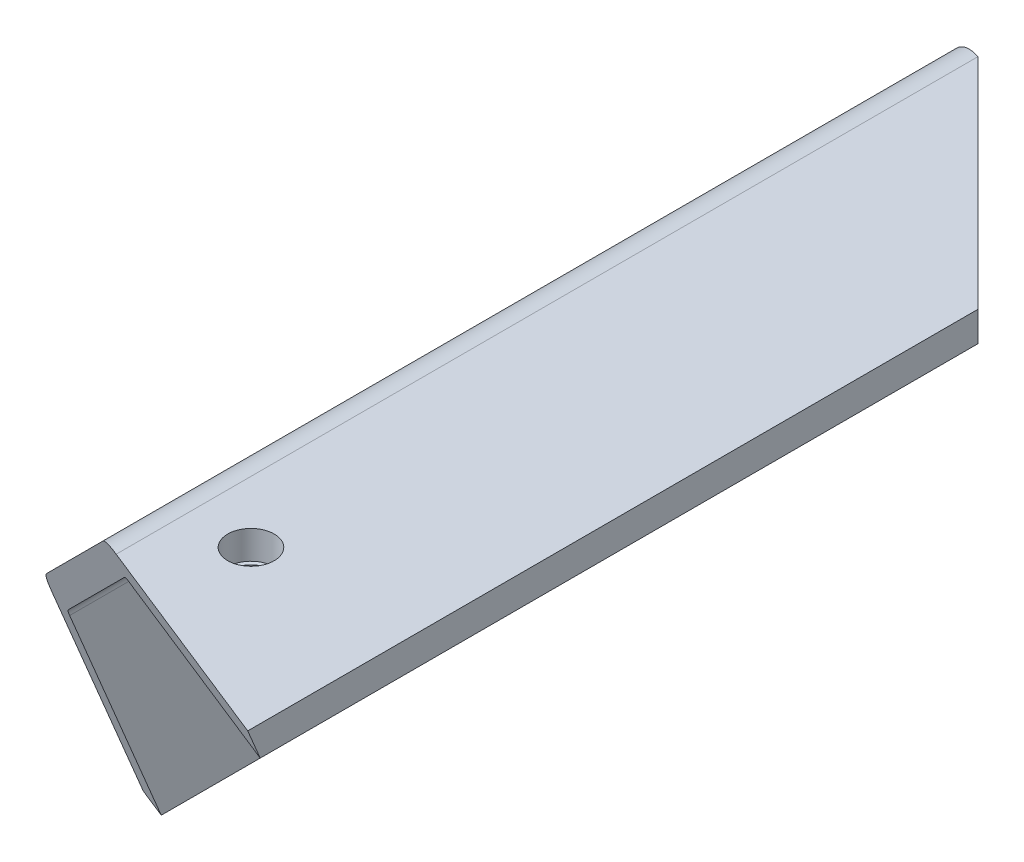
ISO-10303-21;
HEADER;
FILE_DESCRIPTION(('STEP AP214'),'2;1');
FILE_NAME('part.step','',(''),(''),'','','');
FILE_SCHEMA(('AUTOMOTIVE_DESIGN { 1 0 10303 214 1 1 1 1 }'));
ENDSEC;
DATA;
#1=APPLICATION_CONTEXT('core data for automotive mechanical design processes');
#2=APPLICATION_PROTOCOL_DEFINITION('international standard','automotive_design',2000,#1);
#3=PRODUCT_CONTEXT('',#1,'mechanical');
#4=PRODUCT('Part','Part','',(#3));
#5=PRODUCT_RELATED_PRODUCT_CATEGORY('part','',(#4));
#6=PRODUCT_DEFINITION_FORMATION('','',#4);
#7=PRODUCT_DEFINITION_CONTEXT('part definition',#1,'design');
#8=PRODUCT_DEFINITION('design','',#6,#7);
#9=PRODUCT_DEFINITION_SHAPE('','',#8);
#10=(LENGTH_UNIT() NAMED_UNIT(*) SI_UNIT(.MILLI.,.METRE.));
#11=(NAMED_UNIT(*) PLANE_ANGLE_UNIT() SI_UNIT($,.RADIAN.));
#12=(NAMED_UNIT(*) SI_UNIT($,.STERADIAN.) SOLID_ANGLE_UNIT());
#13=UNCERTAINTY_MEASURE_WITH_UNIT(LENGTH_MEASURE(1.E-05),#10,'distance_accuracy_value','');
#14=(GEOMETRIC_REPRESENTATION_CONTEXT(3) GLOBAL_UNCERTAINTY_ASSIGNED_CONTEXT((#13)) GLOBAL_UNIT_ASSIGNED_CONTEXT((#10,
#11,#12)) REPRESENTATION_CONTEXT('',''));
#15=CARTESIAN_POINT('',(0.,0.,0.));
#16=DIRECTION('',(0.,0.,1.));
#17=DIRECTION('',(1.,0.,0.));
#18=AXIS2_PLACEMENT_3D('',#15,#16,#17);
#19=CARTESIAN_POINT('',(-93.8086894866069,111.769201728745,112.900713999999));
#20=DIRECTION('',(0.707106781186544,-0.707106781186551,0.));
#21=DIRECTION('',(0.,0.,-1.));
#22=AXIS2_PLACEMENT_3D('',#19,#20,#21);
#23=PLANE('',#22);
#24=DIRECTION('',(0.612208629196817,0.612208629196811,0.500401027850579));
#25=VECTOR('',#24,1.);
#26=CARTESIAN_POINT('',(-44.4664555320371,161.111435683315,-7.83341614593516));
#27=LINE('',#26,#25);
#28=CARTESIAN_POINT('',(-111.084768855022,94.4931223603303,-62.2852335014474));
#29=VERTEX_POINT('',#28);
#30=CARTESIAN_POINT('',(-94.4931223603302,111.084768855022,-48.7237177636349));
#31=VERTEX_POINT('',#30);
#32=EDGE_CURVE('E465',#29,#31,#27,.T.);
#33=ORIENTED_EDGE('',*,*,#32,.F.);
#34=DIRECTION('',(0.,0.,-1.));
#35=VECTOR('',#34,1.);
#36=CARTESIAN_POINT('',(-111.084768855022,94.4931223603303,-112.900714000001));
#37=LINE('',#36,#35);
#38=CARTESIAN_POINT('',(-111.084768855022,94.4931223603303,-94.4931223603312));
#39=VERTEX_POINT('',#38);
#40=EDGE_CURVE('E170',#39,#29,#37,.F.);
#41=ORIENTED_EDGE('',*,*,#40,.F.);
#42=DIRECTION('',(0.707106781186551,0.707106781186544,0.));
#43=VECTOR('',#42,1.);
#44=CARTESIAN_POINT('',(-94.4931223603302,111.084768855022,-94.4931223603312));
#45=LINE('',#44,#43);
#46=CARTESIAN_POINT('',(-94.4931223603302,111.084768855022,-94.4931223603312));
#47=VERTEX_POINT('',#46);
#48=EDGE_CURVE('E245',#39,#47,#45,.T.);
#49=ORIENTED_EDGE('',*,*,#48,.T.);
#50=DIRECTION('',(0.,0.,1.));
#51=VECTOR('',#50,1.);
#52=CARTESIAN_POINT('',(-94.4931223603302,111.084768855022,112.900713999999));
#53=LINE('',#52,#51);
#54=EDGE_CURVE('E36',#31,#47,#53,.F.);
#55=ORIENTED_EDGE('',*,*,#54,.F.);
#56=EDGE_LOOP('',(#33,#41,#49,#55));
#57=FACE_BOUND('',#56,.T.);
#58=ADVANCED_FACE('F32',(#57),#23,.T.);
#59=CARTESIAN_POINT('',(-94.9402017578616,112.900714,112.900713999999));
#60=DIRECTION('',(0.707106781186544,-0.707106781186551,0.));
#61=DIRECTION('',(0.,0.,-1.));
#62=AXIS2_PLACEMENT_3D('',#59,#60,#61);
#63=PLANE('',#62);
#64=DIRECTION('',(0.,0.,-1.));
#65=VECTOR('',#64,1.);
#66=CARTESIAN_POINT('',(-112.216281126277,95.6246346315851,-112.900714000001));
#67=LINE('',#66,#65);
#68=CARTESIAN_POINT('',(-112.216281126277,95.6246346315851,-94.4931223603313));
#69=VERTEX_POINT('',#68);
#70=CARTESIAN_POINT('',(-112.216281126277,95.6246346315851,-62.2625657235124));
#71=VERTEX_POINT('',#70);
#72=EDGE_CURVE('E42',#69,#71,#67,.F.);
#73=ORIENTED_EDGE('',*,*,#72,.T.);
#74=DIRECTION('',(0.612208629196817,0.612208629196811,0.500401027850579));
#75=VECTOR('',#74,1.);
#76=CARTESIAN_POINT('',(-45.6049120731476,162.236003684714,-7.81642440653975));
#77=LINE('',#76,#75);
#78=CARTESIAN_POINT('',(-95.6246346315849,112.216281126277,-48.7010499857));
#79=VERTEX_POINT('',#78);
#80=EDGE_CURVE('E462',#71,#79,#77,.T.);
#81=ORIENTED_EDGE('',*,*,#80,.T.);
#82=DIRECTION('',(0.,0.,1.));
#83=VECTOR('',#82,1.);
#84=CARTESIAN_POINT('',(-95.6246346315849,112.216281126277,112.900713999999));
#85=LINE('',#84,#83);
#86=CARTESIAN_POINT('',(-95.6246346315849,112.216281126277,-94.4931223603312));
#87=VERTEX_POINT('',#86);
#88=EDGE_CURVE('E105',#79,#87,#85,.F.);
#89=ORIENTED_EDGE('',*,*,#88,.T.);
#90=DIRECTION('',(0.707106781186551,0.707106781186544,0.));
#91=VECTOR('',#90,1.);
#92=CARTESIAN_POINT('',(-94.9402017578616,112.900714,-94.4931223603313));
#93=LINE('',#92,#91);
#94=EDGE_CURVE('E246',#69,#87,#93,.T.);
#95=ORIENTED_EDGE('',*,*,#94,.F.);
#96=EDGE_LOOP('',(#73,#81,#89,#95));
#97=FACE_BOUND('',#96,.T.);
#98=ADVANCED_FACE('F34',(#97),#63,.F.);
#99=CARTESIAN_POINT('',(-93.9722675053082,110.563914,112.900713999999));
#100=DIRECTION('',(0.,0.,1.));
#101=DIRECTION('',(0.,1.,0.));
#102=AXIS2_PLACEMENT_3D('',#99,#100,#101);
#103=CYLINDRICAL_SURFACE('',#102,2.3368);
#104=CARTESIAN_POINT('',(-93.9722675053082,110.563914,-48.7341521376049));
#105=DIRECTION('',(0.345138706889568,0.362481996068263,-0.865728638508028));
#106=DIRECTION('',(0.596979635764421,0.626977982081941,0.500513660619803));
#107=AXIS2_PLACEMENT_3D('',#104,#105,#106);
#108=ELLIPSE('',#107,2.69922917650867,2.3368);
#109=CARTESIAN_POINT('',(-93.9722675053082,112.900714,-47.7557301578584));
#110=VERTEX_POINT('',#109);
#111=EDGE_CURVE('E454',#110,#79,#108,.F.);
#112=ORIENTED_EDGE('',*,*,#111,.F.);
#113=DIRECTION('',(0.,0.,1.));
#114=VECTOR('',#113,1.);
#115=CARTESIAN_POINT('',(-93.9722675053082,112.900714,-112.900714000001));
#116=LINE('',#115,#114);
#117=CARTESIAN_POINT('',(-93.9722675053082,112.900714,-93.9722675053093));
#118=VERTEX_POINT('',#117);
#119=EDGE_CURVE('E84',#110,#118,#116,.F.);
#120=ORIENTED_EDGE('',*,*,#119,.T.);
#121=CARTESIAN_POINT('',(-93.9722675053082,110.563914,-93.9722675053093));
#122=DIRECTION('',(-0.300635186420916,0.,0.953739212093988));
#123=DIRECTION('',(0.953739212093988,0.,0.300635186420916));
#124=AXIS2_PLACEMENT_3D('',#121,#122,#123);
#125=ELLIPSE('',#124,2.45014566913886,2.3368);
#126=EDGE_CURVE('E193',#87,#118,#125,.F.);
#127=ORIENTED_EDGE('',*,*,#126,.F.);
#128=ORIENTED_EDGE('',*,*,#88,.F.);
#129=EDGE_LOOP('',(#112,#120,#127,#128));
#130=FACE_BOUND('',#129,.T.);
#131=ADVANCED_FACE('F270',(#130),#103,.T.);
#132=CARTESIAN_POINT('',(-93.9722675053082,110.563914,112.900713999999));
#133=DIRECTION('',(0.,0.,1.));
#134=DIRECTION('',(0.,1.,0.));
#135=AXIS2_PLACEMENT_3D('',#132,#133,#134);
#136=CYLINDRICAL_SURFACE('',#135,0.736599999999998);
#137=DIRECTION('',(0.,0.,1.));
#138=VECTOR('',#137,1.);
#139=CARTESIAN_POINT('',(-93.9722675053082,111.300514,-112.900714000001));
#140=LINE('',#139,#138);
#141=CARTESIAN_POINT('',(-93.9722675053082,111.300514,-93.9722675053093));
#142=VERTEX_POINT('',#141);
#143=CARTESIAN_POINT('',(-93.9722675053082,111.300514,-48.4257365135544));
#144=VERTEX_POINT('',#143);
#145=EDGE_CURVE('E202',#142,#144,#140,.T.);
#146=ORIENTED_EDGE('',*,*,#145,.T.);
#147=CARTESIAN_POINT('',(-93.9722675053082,110.563914,-48.7341521376049));
#148=DIRECTION('',(0.345138706889568,0.362481996068263,-0.865728638508028));
#149=DIRECTION('',(0.596979635764421,0.626977982081941,0.500513660619803));
#150=AXIS2_PLACEMENT_3D('',#147,#148,#149);
#151=ELLIPSE('',#150,0.850843979551645,0.736599999999998);
#152=EDGE_CURVE('E239',#144,#31,#151,.F.);
#153=ORIENTED_EDGE('',*,*,#152,.T.);
#154=ORIENTED_EDGE('',*,*,#54,.T.);
#155=CARTESIAN_POINT('',(-93.9722675053082,110.563914,-93.9722675053093));
#156=DIRECTION('',(-0.707106781186545,0.,0.70710678118655));
#157=DIRECTION('',(0.707106781186551,0.,0.707106781186545));
#158=AXIS2_PLACEMENT_3D('',#155,#156,#157);
#159=ELLIPSE('',#158,1.04170971004402,0.736599999999998);
#160=EDGE_CURVE('E181',#47,#142,#159,.F.);
#161=ORIENTED_EDGE('',*,*,#160,.T.);
#162=EDGE_LOOP('',(#146,#153,#154,#161));
#163=FACE_BOUND('',#162,.T.);
#164=ADVANCED_FACE('F237',(#163),#136,.F.);
#165=CARTESIAN_POINT('',(-82.2402017578616,112.900714,-112.900714000001));
#166=DIRECTION('',(0.,-1.,0.));
#167=DIRECTION('',(1.,0.,0.));
#168=AXIS2_PLACEMENT_3D('',#165,#166,#167);
#169=PLANE('',#168);
#170=CARTESIAN_POINT('',(-90.675714,112.900714,-51.6878570000011));
#171=DIRECTION('',(0.,1.,0.));
#172=DIRECTION('',(-1.,0.,0.));
#173=AXIS2_PLACEMENT_3D('',#170,#171,#172);
#174=CIRCLE('',#173,1.2446);
#175=CARTESIAN_POINT('',(-91.920314,112.900714,-51.6878570000011));
#176=VERTEX_POINT('',#175);
#177=EDGE_CURVE('E441',#176,#176,#174,.T.);
#178=ORIENTED_EDGE('',*,*,#177,.F.);
#179=EDGE_LOOP('',(#178));
#180=FACE_BOUND('',#179,.T.);
#181=ORIENTED_EDGE('',*,*,#119,.F.);
#182=DIRECTION('',(0.928902584452961,0.,0.370324166908682));
#183=VECTOR('',#182,1.);
#184=CARTESIAN_POINT('',(-106.258690770684,112.900714,-52.6539396538707));
#185=LINE('',#184,#183);
#186=CARTESIAN_POINT('',(-82.2402017578616,112.900714,-43.0785255222402));
#187=VERTEX_POINT('',#186);
#188=EDGE_CURVE('E453',#110,#187,#185,.T.);
#189=ORIENTED_EDGE('',*,*,#188,.T.);
#190=DIRECTION('',(0.,0.,-1.));
#191=VECTOR('',#190,1.);
#192=CARTESIAN_POINT('',(-82.2402017578616,112.900714,-112.900714000001));
#193=LINE('',#192,#191);
#194=CARTESIAN_POINT('',(-82.2402017578616,112.900714,-82.2402017578628));
#195=VERTEX_POINT('',#194);
#196=EDGE_CURVE('E228',#187,#195,#193,.T.);
#197=ORIENTED_EDGE('',*,*,#196,.T.);
#198=DIRECTION('',(-0.707106781186551,0.,-0.707106781186545));
#199=VECTOR('',#198,1.);
#200=CARTESIAN_POINT('',(-97.5704578789307,112.900714,-97.5704578789317));
#201=LINE('',#200,#199);
#202=EDGE_CURVE('E218',#195,#118,#201,.T.);
#203=ORIENTED_EDGE('',*,*,#202,.T.);
#204=EDGE_LOOP('',(#181,#189,#197,#203));
#205=FACE_BOUND('',#204,.T.);
#206=ADVANCED_FACE('F291',(#180,#205),#169,.F.);
#207=CARTESIAN_POINT('',(-82.2402017578616,111.300514,-112.900714000001));
#208=DIRECTION('',(0.,-1.,0.));
#209=DIRECTION('',(1.,0.,0.));
#210=AXIS2_PLACEMENT_3D('',#207,#208,#209);
#211=PLANE('',#210);
#212=DIRECTION('',(0.928902584452961,0.,0.370324166908682));
#213=VECTOR('',#212,1.);
#214=CARTESIAN_POINT('',(-106.028211883619,111.300514,-53.2320613455869));
#215=LINE('',#214,#213);
#216=CARTESIAN_POINT('',(-82.2402017578616,111.300514,-43.7485318779363));
#217=VERTEX_POINT('',#216);
#218=EDGE_CURVE('E452',#144,#217,#215,.T.);
#219=ORIENTED_EDGE('',*,*,#218,.F.);
#220=ORIENTED_EDGE('',*,*,#145,.F.);
#221=DIRECTION('',(-0.707106781186551,0.,-0.707106781186545));
#222=VECTOR('',#221,1.);
#223=CARTESIAN_POINT('',(-97.5704578789307,111.300514,-97.5704578789317));
#224=LINE('',#223,#222);
#225=CARTESIAN_POINT('',(-82.2402017578616,111.300514,-82.2402017578628));
#226=VERTEX_POINT('',#225);
#227=EDGE_CURVE('E192',#226,#142,#224,.T.);
#228=ORIENTED_EDGE('',*,*,#227,.F.);
#229=DIRECTION('',(0.,0.,1.));
#230=VECTOR('',#229,1.);
#231=CARTESIAN_POINT('',(-82.2402017578616,111.300514,-112.900714000001));
#232=LINE('',#231,#230);
#233=EDGE_CURVE('E97',#217,#226,#232,.F.);
#234=ORIENTED_EDGE('',*,*,#233,.F.);
#235=EDGE_LOOP('',(#219,#220,#228,#234));
#236=FACE_BOUND('',#235,.T.);
#237=CARTESIAN_POINT('',(-90.675714,111.300514,-51.687857000001));
#238=DIRECTION('',(0.,-1.,0.));
#239=DIRECTION('',(1.,0.,0.));
#240=AXIS2_PLACEMENT_3D('',#237,#238,#239);
#241=CIRCLE('',#240,1.11778190344489);
#242=CARTESIAN_POINT('',(-89.5579320965551,111.300514,-51.687857000001));
#243=VERTEX_POINT('',#242);
#244=EDGE_CURVE('E179',#243,#243,#241,.T.);
#245=ORIENTED_EDGE('',*,*,#244,.F.);
#246=EDGE_LOOP('',(#245));
#247=FACE_BOUND('',#246,.T.);
#248=ADVANCED_FACE('F296',(#236,#247),#211,.T.);
#249=CARTESIAN_POINT('',(-82.2402017578616,112.900714,-112.900714000001));
#250=DIRECTION('',(-1.,0.,0.));
#251=DIRECTION('',(0.,-1.,0.));
#252=AXIS2_PLACEMENT_3D('',#249,#250,#251);
#253=PLANE('',#252);
#254=ORIENTED_EDGE('',*,*,#196,.F.);
#255=DIRECTION('',(0.,-0.922409121004533,-0.386214206739788));
#256=VECTOR('',#255,1.);
#257=CARTESIAN_POINT('',(-82.2402017578616,88.0267334244244,-53.4933018483837));
#258=LINE('',#257,#256);
#259=EDGE_CURVE('E248',#187,#217,#258,.T.);
#260=ORIENTED_EDGE('',*,*,#259,.T.);
#261=ORIENTED_EDGE('',*,*,#233,.T.);
#262=DIRECTION('',(0.,-1.,0.));
#263=VECTOR('',#262,1.);
#264=CARTESIAN_POINT('',(-82.2402017578616,111.300514,-82.2402017578628));
#265=LINE('',#264,#263);
#266=EDGE_CURVE('E213',#226,#195,#265,.F.);
#267=ORIENTED_EDGE('',*,*,#266,.T.);
#268=EDGE_LOOP('',(#254,#260,#261,#267));
#269=FACE_BOUND('',#268,.T.);
#270=ADVANCED_FACE('F279',(#269),#253,.F.);
#271=CARTESIAN_POINT('',(-110.563914,93.9722675053083,-112.900714000001));
#272=DIRECTION('',(0.,0.,-1.));
#273=DIRECTION('',(-1.,0.,0.));
#274=AXIS2_PLACEMENT_3D('',#271,#272,#273);
#275=CYLINDRICAL_SURFACE('',#274,2.3368);
#276=CARTESIAN_POINT('',(-110.563914,93.9722675053083,-62.2956678754174));
#277=DIRECTION('',(0.345138706889568,0.362481996068263,-0.865728638508028));
#278=DIRECTION('',(-0.596979635764421,-0.626977982081941,-0.500513660619803));
#279=AXIS2_PLACEMENT_3D('',#276,#277,#278);
#280=ELLIPSE('',#279,2.69922917650867,2.3368);
#281=CARTESIAN_POINT('',(-112.900714,93.9722675053084,-63.2272763429962));
#282=VERTEX_POINT('',#281);
#283=EDGE_CURVE('E466',#71,#282,#280,.F.);
#284=ORIENTED_EDGE('',*,*,#283,.F.);
#285=ORIENTED_EDGE('',*,*,#72,.F.);
#286=CARTESIAN_POINT('',(-110.563914,93.9722675053083,-93.9722675053092));
#287=DIRECTION('',(0.,-0.300635186420926,-0.953739212093985));
#288=DIRECTION('',(0.,0.953739212093985,-0.300635186420926));
#289=AXIS2_PLACEMENT_3D('',#286,#287,#288);
#290=ELLIPSE('',#289,2.45014566913887,2.3368);
#291=CARTESIAN_POINT('',(-112.900714,93.9722675053084,-93.9722675053093));
#292=VERTEX_POINT('',#291);
#293=EDGE_CURVE('E207',#69,#292,#290,.F.);
#294=ORIENTED_EDGE('',*,*,#293,.T.);
#295=DIRECTION('',(0.,0.,-1.));
#296=VECTOR('',#295,1.);
#297=CARTESIAN_POINT('',(-112.900714,93.9722675053084,112.900713999999));
#298=LINE('',#297,#296);
#299=EDGE_CURVE('E168',#292,#282,#298,.F.);
#300=ORIENTED_EDGE('',*,*,#299,.T.);
#301=EDGE_LOOP('',(#284,#285,#294,#300));
#302=FACE_BOUND('',#301,.T.);
#303=ADVANCED_FACE('F276',(#302),#275,.T.);
#304=CARTESIAN_POINT('',(-110.563914,93.9722675053083,-112.900714000001));
#305=DIRECTION('',(0.,0.,-1.));
#306=DIRECTION('',(-1.,0.,0.));
#307=AXIS2_PLACEMENT_3D('',#304,#305,#306);
#308=CYLINDRICAL_SURFACE('',#307,0.736599999999999);
#309=ORIENTED_EDGE('',*,*,#40,.T.);
#310=CARTESIAN_POINT('',(-110.563914,93.9722675053083,-62.2956678754174));
#311=DIRECTION('',(0.345138706889568,0.362481996068263,-0.865728638508028));
#312=DIRECTION('',(-0.596979635764421,-0.626977982081941,-0.500513660619803));
#313=AXIS2_PLACEMENT_3D('',#310,#311,#312);
#314=ELLIPSE('',#313,0.850843979551646,0.736599999999999);
#315=CARTESIAN_POINT('',(-111.300514,93.9722675053084,-62.5893270662846));
#316=VERTEX_POINT('',#315);
#317=EDGE_CURVE('E469',#29,#316,#314,.F.);
#318=ORIENTED_EDGE('',*,*,#317,.T.);
#319=DIRECTION('',(0.,0.,-1.));
#320=VECTOR('',#319,1.);
#321=CARTESIAN_POINT('',(-111.300514,93.9722675053084,112.900713999999));
#322=LINE('',#321,#320);
#323=CARTESIAN_POINT('',(-111.300514,93.9722675053083,-93.9722675053092));
#324=VERTEX_POINT('',#323);
#325=EDGE_CURVE('E57',#316,#324,#322,.T.);
#326=ORIENTED_EDGE('',*,*,#325,.T.);
#327=CARTESIAN_POINT('',(-110.563914,93.9722675053083,-93.9722675053092));
#328=DIRECTION('',(0.,-0.707106781186545,-0.70710678118655));
#329=DIRECTION('',(0.,0.70710678118655,-0.707106781186545));
#330=AXIS2_PLACEMENT_3D('',#327,#328,#329);
#331=ELLIPSE('',#330,1.04170971004402,0.736599999999999);
#332=EDGE_CURVE('E205',#39,#324,#331,.F.);
#333=ORIENTED_EDGE('',*,*,#332,.F.);
#334=EDGE_LOOP('',(#309,#318,#326,#333));
#335=FACE_BOUND('',#334,.T.);
#336=ADVANCED_FACE('F272',(#335),#308,.F.);
#337=CARTESIAN_POINT('',(-112.900714,94.2773772153524,-112.900714000001));
#338=DIRECTION('',(1.,0.,0.));
#339=DIRECTION('',(0.,1.,0.));
#340=AXIS2_PLACEMENT_3D('',#337,#338,#339);
#341=PLANE('',#340);
#342=DIRECTION('',(0.,0.,1.));
#343=VECTOR('',#342,1.);
#344=CARTESIAN_POINT('',(-112.900714,82.2402017578618,-112.900714000001));
#345=LINE('',#344,#343);
#346=CARTESIAN_POINT('',(-112.900714,82.2402017578618,-82.2402017578628));
#347=VERTEX_POINT('',#346);
#348=CARTESIAN_POINT('',(-112.900714,82.2402017578618,-68.1395114487535));
#349=VERTEX_POINT('',#348);
#350=EDGE_CURVE('E167',#347,#349,#345,.T.);
#351=ORIENTED_EDGE('',*,*,#350,.T.);
#352=DIRECTION('',(0.,0.922409121004532,0.386214206739792));
#353=VECTOR('',#352,1.);
#354=CARTESIAN_POINT('',(-112.900714,76.5358282923762,-70.5279419431536));
#355=LINE('',#354,#353);
#356=EDGE_CURVE('E49',#349,#282,#355,.T.);
#357=ORIENTED_EDGE('',*,*,#356,.T.);
#358=ORIENTED_EDGE('',*,*,#299,.F.);
#359=DIRECTION('',(0.,-0.70710678118655,0.707106781186545));
#360=VECTOR('',#359,1.);
#361=CARTESIAN_POINT('',(-112.900714,112.900714,-112.900714000001));
#362=LINE('',#361,#360);
#363=EDGE_CURVE('E211',#292,#347,#362,.T.);
#364=ORIENTED_EDGE('',*,*,#363,.T.);
#365=EDGE_LOOP('',(#351,#357,#358,#364));
#366=FACE_BOUND('',#365,.T.);
#367=ADVANCED_FACE('F275',(#366),#341,.F.);
#368=CARTESIAN_POINT('',(-111.300514,94.2773772153523,-112.900714000001));
#369=DIRECTION('',(1.,0.,0.));
#370=DIRECTION('',(0.,1.,0.));
#371=AXIS2_PLACEMENT_3D('',#368,#369,#370);
#372=PLANE('',#371);
#373=DIRECTION('',(0.,0.922409121004532,0.386214206739792));
#374=VECTOR('',#373,1.);
#375=CARTESIAN_POINT('',(-111.300514,76.3085604529819,-69.9851500822897));
#376=LINE('',#375,#374);
#377=CARTESIAN_POINT('',(-111.300514,82.2402017578618,-67.5015621720419));
#378=VERTEX_POINT('',#377);
#379=EDGE_CURVE('E155',#378,#316,#376,.T.);
#380=ORIENTED_EDGE('',*,*,#379,.F.);
#381=DIRECTION('',(0.,0.,-1.));
#382=VECTOR('',#381,1.);
#383=CARTESIAN_POINT('',(-111.300514,82.2402017578618,112.900713999999));
#384=LINE('',#383,#382);
#385=CARTESIAN_POINT('',(-111.300514,82.2402017578618,-82.2402017578628));
#386=VERTEX_POINT('',#385);
#387=EDGE_CURVE('E164',#386,#378,#384,.F.);
#388=ORIENTED_EDGE('',*,*,#387,.F.);
#389=DIRECTION('',(0.,-0.70710678118655,0.707106781186545));
#390=VECTOR('',#389,1.);
#391=CARTESIAN_POINT('',(-111.300514,112.900714,-112.900714000001));
#392=LINE('',#391,#390);
#393=EDGE_CURVE('E223',#324,#386,#392,.T.);
#394=ORIENTED_EDGE('',*,*,#393,.F.);
#395=ORIENTED_EDGE('',*,*,#325,.F.);
#396=EDGE_LOOP('',(#380,#388,#394,#395));
#397=FACE_BOUND('',#396,.T.);
#398=ADVANCED_FACE('F162',(#397),#372,.T.);
#399=CARTESIAN_POINT('',(-112.900714,82.2402017578618,112.900713999999));
#400=DIRECTION('',(0.,1.,0.));
#401=DIRECTION('',(-1.,0.,0.));
#402=AXIS2_PLACEMENT_3D('',#399,#400,#401);
#403=PLANE('',#402);
#404=ORIENTED_EDGE('',*,*,#387,.T.);
#405=DIRECTION('',(-0.928902584452963,0.,-0.370324166908678));
#406=VECTOR('',#405,1.);
#407=CARTESIAN_POINT('',(-50.6237679371484,82.2402017578612,-43.3116569951845));
#408=LINE('',#407,#406);
#409=EDGE_CURVE('E11',#378,#349,#408,.T.);
#410=ORIENTED_EDGE('',*,*,#409,.T.);
#411=ORIENTED_EDGE('',*,*,#350,.F.);
#412=DIRECTION('',(-1.,0.,0.));
#413=VECTOR('',#412,1.);
#414=CARTESIAN_POINT('',(-112.900714,82.2402017578618,-82.2402017578628));
#415=LINE('',#414,#413);
#416=EDGE_CURVE('E69',#347,#386,#415,.F.);
#417=ORIENTED_EDGE('',*,*,#416,.T.);
#418=EDGE_LOOP('',(#404,#410,#411,#417));
#419=FACE_BOUND('',#418,.T.);
#420=ADVANCED_FACE('F166',(#419),#403,.F.);
#421=CARTESIAN_POINT('',(-112.900714,112.900714,-112.900714000001));
#422=DIRECTION('',(0.,0.707106781186545,0.70710678118655));
#423=DIRECTION('',(0.,-0.70710678118655,0.707106781186545));
#424=AXIS2_PLACEMENT_3D('',#421,#422,#423);
#425=PLANE('',#424);
#426=ORIENTED_EDGE('',*,*,#363,.F.);
#427=DIRECTION('',(-1.,0.,0.));
#428=VECTOR('',#427,1.);
#429=CARTESIAN_POINT('',(-112.900714,93.9722675053084,-93.9722675053092));
#430=LINE('',#429,#428);
#431=EDGE_CURVE('E76',#292,#324,#430,.F.);
#432=ORIENTED_EDGE('',*,*,#431,.T.);
#433=ORIENTED_EDGE('',*,*,#393,.T.);
#434=ORIENTED_EDGE('',*,*,#416,.F.);
#435=EDGE_LOOP('',(#426,#432,#433,#434));
#436=FACE_BOUND('',#435,.T.);
#437=ADVANCED_FACE('F283',(#436),#425,.F.);
#438=CARTESIAN_POINT('',(-110.563914,96.3090675053083,-94.7088675053092));
#439=CARTESIAN_POINT('',(-110.563914,95.7756675053083,-94.7088675053093));
#440=CARTESIAN_POINT('',(-110.563914,95.2422675053083,-94.7088675053093));
#441=CARTESIAN_POINT('',(-110.563914,94.7088675053083,-94.7088675053092));
#442=CARTESIAN_POINT('',(-115.237514,96.3090675053084,-94.7088675053092));
#443=CARTESIAN_POINT('',(-114.170714,95.7756675053084,-94.7088675053092));
#444=CARTESIAN_POINT('',(-113.103914,95.2422675053083,-94.7088675053092));
#445=CARTESIAN_POINT('',(-112.037114,94.7088675053083,-94.7088675053092));
#446=CARTESIAN_POINT('',(-115.237514,91.6354675053084,-93.2356675053093));
#447=CARTESIAN_POINT('',(-114.170714,92.1688675053084,-93.2356675053093));
#448=CARTESIAN_POINT('',(-113.103914,92.7022675053083,-93.2356675053093));
#449=CARTESIAN_POINT('',(-112.037114,93.2356675053083,-93.2356675053093));
#450=CARTESIAN_POINT('',(-110.563914,91.6354675053083,-93.2356675053093));
#451=CARTESIAN_POINT('',(-110.563914,92.1688675053083,-93.2356675053093));
#452=CARTESIAN_POINT('',(-110.563914,92.7022675053083,-93.2356675053093));
#453=CARTESIAN_POINT('',(-110.563914,93.2356675053083,-93.2356675053093));
#454=CARTESIAN_POINT('',(-105.890314,91.6354675053083,-93.2356675053093));
#455=CARTESIAN_POINT('',(-106.957114,92.1688675053083,-93.2356675053093));
#456=CARTESIAN_POINT('',(-108.023914,92.7022675053083,-93.2356675053093));
#457=CARTESIAN_POINT('',(-109.090714,93.2356675053083,-93.2356675053093));
#458=CARTESIAN_POINT('',(-105.890314,96.3090675053083,-94.7088675053092));
#459=CARTESIAN_POINT('',(-106.957114,95.7756675053083,-94.7088675053092));
#460=CARTESIAN_POINT('',(-108.023914,95.2422675053083,-94.7088675053092));
#461=CARTESIAN_POINT('',(-109.090714,94.7088675053083,-94.7088675053092));
#462=CARTESIAN_POINT('',(-110.563914,96.3090675053083,-94.7088675053092));
#463=CARTESIAN_POINT('',(-110.563914,95.7756675053083,-94.7088675053093));
#464=CARTESIAN_POINT('',(-110.563914,95.2422675053083,-94.7088675053093));
#465=CARTESIAN_POINT('',(-110.563914,94.7088675053083,-94.7088675053092));
#466=(BOUNDED_SURFACE() B_SPLINE_SURFACE(3,3,((#438,#439,#440,#441),(#442,#443,#444,#445),(#446,
#447,#448,#449),(#450,#451,#452,#453),(#454,#455,#456,#457),(#458,#459,#460,#461),(#462,#463,
#464,#465)),.UNSPECIFIED.,.T.,.F.,.F.) B_SPLINE_SURFACE_WITH_KNOTS((4,3,4),(4,4),(0.,0.5,1.),
(0.,1.),.UNSPECIFIED.) GEOMETRIC_REPRESENTATION_ITEM() RATIONAL_B_SPLINE_SURFACE(((1.,1.,1.,1.),
(0.333333333333333,0.333333333333333,0.333333333333333,0.333333333333333),(0.333333333333333,
0.333333333333333,0.333333333333333,0.333333333333333),(1.,1.,1.,1.),(0.333333333333333,
0.333333333333333,0.333333333333333,0.333333333333333),(0.333333333333333,0.333333333333333,
0.333333333333333,0.333333333333333),(1.,1.,1.,1.))) REPRESENTATION_ITEM('') SURFACE());
#467=DIRECTION('',(0.707106781186544,-0.707106781186551,0.));
#468=VECTOR('',#467,1.);
#469=CARTESIAN_POINT('',(-111.084768855022,94.4931223603303,-94.4931223603312));
#470=LINE('',#469,#468);
#471=EDGE_CURVE('E200',#39,#69,#470,.F.);
#472=ORIENTED_EDGE('',*,*,#332,.T.);
#473=ORIENTED_EDGE('',*,*,#431,.F.);
#474=ORIENTED_EDGE('',*,*,#293,.F.);
#475=ORIENTED_EDGE('',*,*,#471,.F.);
#476=EDGE_LOOP('',(#472,#473,#474,#475));
#477=FACE_BOUND('',#476,.T.);
#478=ADVANCED_FACE('F262',(#477),#466,.F.);
#479=CARTESIAN_POINT('',(-97.5704578789307,111.300514,-97.5704578789317));
#480=DIRECTION('',(-0.707106781186545,0.,0.70710678118655));
#481=DIRECTION('',(-0.707106781186551,0.,-0.707106781186545));
#482=AXIS2_PLACEMENT_3D('',#479,#480,#481);
#483=PLANE('',#482);
#484=ORIENTED_EDGE('',*,*,#227,.T.);
#485=DIRECTION('',(0.,-1.,0.));
#486=VECTOR('',#485,1.);
#487=CARTESIAN_POINT('',(-93.9722675053082,111.300514,-93.9722675053093));
#488=LINE('',#487,#486);
#489=EDGE_CURVE('E112',#142,#118,#488,.F.);
#490=ORIENTED_EDGE('',*,*,#489,.T.);
#491=ORIENTED_EDGE('',*,*,#202,.F.);
#492=ORIENTED_EDGE('',*,*,#266,.F.);
#493=EDGE_LOOP('',(#484,#490,#491,#492));
#494=FACE_BOUND('',#493,.T.);
#495=ADVANCED_FACE('F253',(#494),#483,.F.);
#496=CARTESIAN_POINT('',(-91.6354675053082,110.563914,-93.2356675053093));
#497=CARTESIAN_POINT('',(-92.1688675053082,110.563914,-93.2356675053093));
#498=CARTESIAN_POINT('',(-92.7022675053082,110.563914,-93.2356675053093));
#499=CARTESIAN_POINT('',(-93.2356675053082,110.563914,-93.2356675053093));
#500=CARTESIAN_POINT('',(-91.6354675053082,105.890314,-93.2356675053093));
#501=CARTESIAN_POINT('',(-92.1688675053082,106.957114,-93.2356675053093));
#502=CARTESIAN_POINT('',(-92.7022675053082,108.023914,-93.2356675053093));
#503=CARTESIAN_POINT('',(-93.2356675053082,109.090714,-93.2356675053093));
#504=CARTESIAN_POINT('',(-96.3090675053082,105.890314,-94.7088675053092));
#505=CARTESIAN_POINT('',(-95.7756675053082,106.957114,-94.7088675053093));
#506=CARTESIAN_POINT('',(-95.2422675053082,108.023914,-94.7088675053093));
#507=CARTESIAN_POINT('',(-94.7088675053082,109.090714,-94.7088675053093));
#508=CARTESIAN_POINT('',(-96.3090675053082,110.563914,-94.7088675053092));
#509=CARTESIAN_POINT('',(-95.7756675053082,110.563914,-94.7088675053093));
#510=CARTESIAN_POINT('',(-95.2422675053082,110.563914,-94.7088675053092));
#511=CARTESIAN_POINT('',(-94.7088675053082,110.563914,-94.7088675053093));
#512=CARTESIAN_POINT('',(-96.3090675053082,115.237514,-94.7088675053092));
#513=CARTESIAN_POINT('',(-95.7756675053082,114.170714,-94.7088675053093));
#514=CARTESIAN_POINT('',(-95.2422675053082,113.103914,-94.7088675053093));
#515=CARTESIAN_POINT('',(-94.7088675053082,112.037114,-94.7088675053093));
#516=CARTESIAN_POINT('',(-91.6354675053082,115.237514,-93.2356675053093));
#517=CARTESIAN_POINT('',(-92.1688675053082,114.170714,-93.2356675053093));
#518=CARTESIAN_POINT('',(-92.7022675053082,113.103914,-93.2356675053093));
#519=CARTESIAN_POINT('',(-93.2356675053082,112.037114,-93.2356675053093));
#520=CARTESIAN_POINT('',(-91.6354675053082,110.563914,-93.2356675053093));
#521=CARTESIAN_POINT('',(-92.1688675053082,110.563914,-93.2356675053093));
#522=CARTESIAN_POINT('',(-92.7022675053082,110.563914,-93.2356675053093));
#523=CARTESIAN_POINT('',(-93.2356675053082,110.563914,-93.2356675053093));
#524=(BOUNDED_SURFACE() B_SPLINE_SURFACE(3,3,((#496,#497,#498,#499),(#500,#501,#502,#503),(#504,
#505,#506,#507),(#508,#509,#510,#511),(#512,#513,#514,#515),(#516,#517,#518,#519),(#520,#521,
#522,#523)),.UNSPECIFIED.,.T.,.F.,.F.) B_SPLINE_SURFACE_WITH_KNOTS((4,3,4),(4,4),(0.,0.5,1.),
(0.,1.),.UNSPECIFIED.) GEOMETRIC_REPRESENTATION_ITEM() RATIONAL_B_SPLINE_SURFACE(((1.,1.,1.,1.),
(0.333333333333333,0.333333333333333,0.333333333333333,0.333333333333333),(0.333333333333333,
0.333333333333333,0.333333333333333,0.333333333333333),(1.,1.,1.,1.),(0.333333333333333,
0.333333333333333,0.333333333333333,0.333333333333333),(0.333333333333333,0.333333333333333,
0.333333333333333,0.333333333333333),(1.,1.,1.,1.))) REPRESENTATION_ITEM('') SURFACE());
#525=DIRECTION('',(0.707106781186544,-0.707106781186551,0.));
#526=VECTOR('',#525,1.);
#527=CARTESIAN_POINT('',(-94.4931223603302,111.084768855022,-94.4931223603312));
#528=LINE('',#527,#526);
#529=EDGE_CURVE('E189',#47,#87,#528,.F.);
#530=ORIENTED_EDGE('',*,*,#489,.F.);
#531=ORIENTED_EDGE('',*,*,#160,.F.);
#532=ORIENTED_EDGE('',*,*,#529,.T.);
#533=ORIENTED_EDGE('',*,*,#126,.T.);
#534=EDGE_LOOP('',(#530,#531,#532,#533));
#535=FACE_BOUND('',#534,.T.);
#536=ADVANCED_FACE('F250',(#535),#524,.T.);
#537=CARTESIAN_POINT('',(-90.675714,111.376714,-51.687857000001));
#538=DIRECTION('',(0.,1.,0.));
#539=DIRECTION('',(-1.,0.,0.));
#540=AXIS2_PLACEMENT_3D('',#537,#538,#539);
#541=CONICAL_SURFACE('',#540,1.2446,1.02974425867665);
#542=ORIENTED_EDGE('',*,*,#244,.T.);
#543=EDGE_LOOP('',(#542));
#544=FACE_BOUND('',#543,.T.);
#545=CARTESIAN_POINT('',(-90.675714,111.376714,-51.687857000001));
#546=DIRECTION('',(0.,1.,0.));
#547=DIRECTION('',(-1.,0.,0.));
#548=AXIS2_PLACEMENT_3D('',#545,#546,#547);
#549=CIRCLE('',#548,1.2446);
#550=CARTESIAN_POINT('',(-91.920314,111.376714,-51.687857000001));
#551=VERTEX_POINT('',#550);
#552=EDGE_CURVE('E182',#551,#551,#549,.T.);
#553=ORIENTED_EDGE('',*,*,#552,.T.);
#554=EDGE_LOOP('',(#553));
#555=FACE_BOUND('',#554,.T.);
#556=ADVANCED_FACE('F252',(#544,#555),#541,.F.);
#557=CARTESIAN_POINT('',(-90.675714,112.900714,-51.6878570000011));
#558=DIRECTION('',(0.,1.,0.));
#559=DIRECTION('',(-1.,0.,0.));
#560=AXIS2_PLACEMENT_3D('',#557,#558,#559);
#561=CYLINDRICAL_SURFACE('',#560,1.2446);
#562=ORIENTED_EDGE('',*,*,#552,.F.);
#563=EDGE_LOOP('',(#562));
#564=FACE_BOUND('',#563,.T.);
#565=ORIENTED_EDGE('',*,*,#177,.T.);
#566=EDGE_LOOP('',(#565));
#567=FACE_BOUND('',#566,.T.);
#568=ADVANCED_FACE('F259',(#564,#567),#561,.F.);
#569=CARTESIAN_POINT('',(-94.4931223603302,111.084768855022,-94.4931223603312));
#570=DIRECTION('',(0.,0.,-1.));
#571=DIRECTION('',(0.707106781186551,0.707106781186544,0.));
#572=AXIS2_PLACEMENT_3D('',#569,#570,#571);
#573=PLANE('',#572);
#574=ORIENTED_EDGE('',*,*,#48,.F.);
#575=ORIENTED_EDGE('',*,*,#471,.T.);
#576=ORIENTED_EDGE('',*,*,#94,.T.);
#577=ORIENTED_EDGE('',*,*,#529,.F.);
#578=EDGE_LOOP('',(#574,#575,#576,#577));
#579=FACE_BOUND('',#578,.T.);
#580=ADVANCED_FACE('F244',(#579),#573,.T.);
#581=CARTESIAN_POINT('',(-19.9106319026301,239.743118636919,34.8794305366205));
#582=DIRECTION('',(0.345138706889568,0.362481996068263,-0.865728638508028));
#583=DIRECTION('',(0.,0.922409121004533,0.386214206739788));
#584=AXIS2_PLACEMENT_3D('',#581,#582,#583);
#585=PLANE('',#584);
#586=ORIENTED_EDGE('',*,*,#188,.F.);
#587=ORIENTED_EDGE('',*,*,#111,.T.);
#588=ORIENTED_EDGE('',*,*,#80,.F.);
#589=ORIENTED_EDGE('',*,*,#283,.T.);
#590=ORIENTED_EDGE('',*,*,#356,.F.);
#591=ORIENTED_EDGE('',*,*,#409,.F.);
#592=ORIENTED_EDGE('',*,*,#379,.T.);
#593=ORIENTED_EDGE('',*,*,#317,.F.);
#594=ORIENTED_EDGE('',*,*,#32,.T.);
#595=ORIENTED_EDGE('',*,*,#152,.F.);
#596=ORIENTED_EDGE('',*,*,#218,.T.);
#597=ORIENTED_EDGE('',*,*,#259,.F.);
#598=EDGE_LOOP('',(#586,#587,#588,#589,#590,#591,#592,#593,#594,#595,#596,#597));
#599=FACE_BOUND('',#598,.T.);
#600=ADVANCED_FACE('F154',(#599),#585,.F.);
#601=CLOSED_SHELL('',(#58,#98,#131,#164,#206,#248,#270,#303,#336,#367,#398,#420,#437,#478,#495,
#536,#556,#568,#580,#600));
#602=MANIFOLD_SOLID_BREP('B2',#601);
#603=ADVANCED_BREP_SHAPE_REPRESENTATION('',(#18,#602),#14);
#604=SHAPE_DEFINITION_REPRESENTATION(#9,#603);
ENDSEC;
END-ISO-10303-21;
